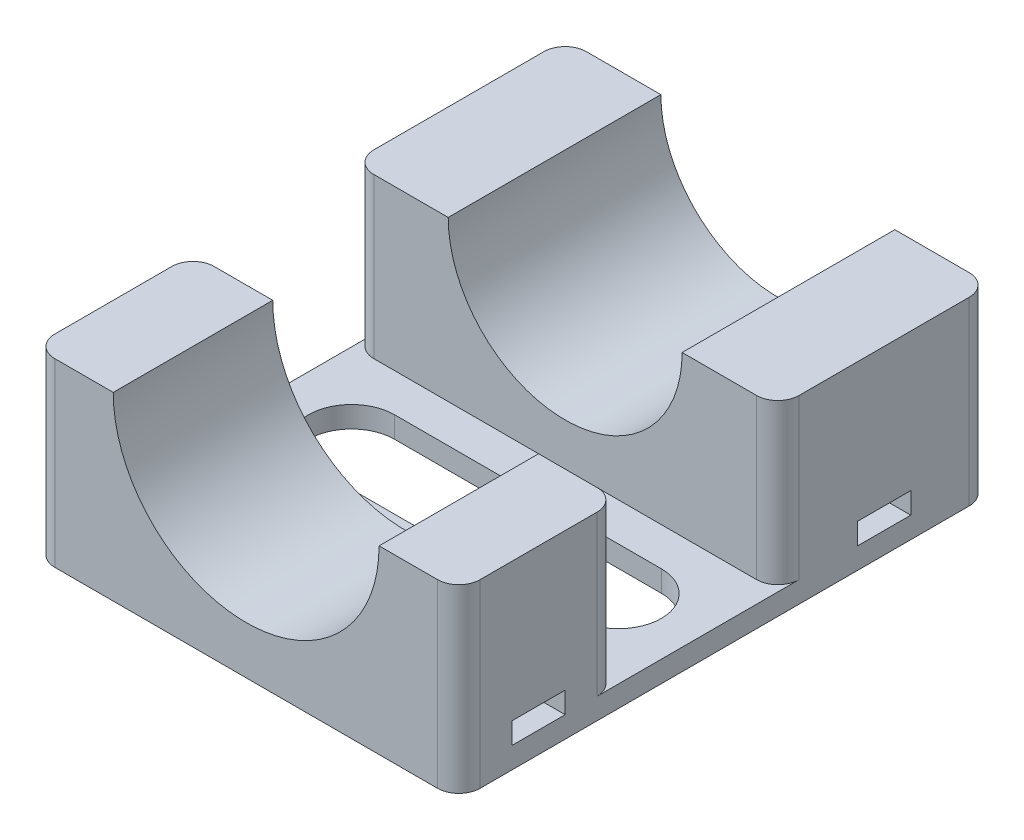
ISO-10303-21;
HEADER;
FILE_DESCRIPTION(('STEP AP214'),'2;1');
FILE_NAME('part.step','',(''),(''),'','','');
FILE_SCHEMA(('AUTOMOTIVE_DESIGN { 1 0 10303 214 1 1 1 1 }'));
ENDSEC;
DATA;
#1=APPLICATION_CONTEXT('core data for automotive mechanical design processes');
#2=APPLICATION_PROTOCOL_DEFINITION('international standard','automotive_design',2000,#1);
#3=PRODUCT_CONTEXT('',#1,'mechanical');
#4=PRODUCT('Part','Part','',(#3));
#5=PRODUCT_RELATED_PRODUCT_CATEGORY('part','',(#4));
#6=PRODUCT_DEFINITION_FORMATION('','',#4);
#7=PRODUCT_DEFINITION_CONTEXT('part definition',#1,'design');
#8=PRODUCT_DEFINITION('design','',#6,#7);
#9=PRODUCT_DEFINITION_SHAPE('','',#8);
#10=(LENGTH_UNIT() NAMED_UNIT(*) SI_UNIT(.MILLI.,.METRE.));
#11=(NAMED_UNIT(*) PLANE_ANGLE_UNIT() SI_UNIT($,.RADIAN.));
#12=(NAMED_UNIT(*) SI_UNIT($,.STERADIAN.) SOLID_ANGLE_UNIT());
#13=UNCERTAINTY_MEASURE_WITH_UNIT(LENGTH_MEASURE(1.E-05),#10,'distance_accuracy_value','');
#14=(GEOMETRIC_REPRESENTATION_CONTEXT(3) GLOBAL_UNCERTAINTY_ASSIGNED_CONTEXT((#13)) GLOBAL_UNIT_ASSIGNED_CONTEXT((#10,
#11,#12)) REPRESENTATION_CONTEXT('',''));
#15=CARTESIAN_POINT('',(0.,0.,0.));
#16=DIRECTION('',(0.,0.,1.));
#17=DIRECTION('',(1.,0.,0.));
#18=AXIS2_PLACEMENT_3D('',#15,#16,#17);
#19=CARTESIAN_POINT('',(18.,2.,23.));
#20=DIRECTION('',(0.,-1.,0.));
#21=DIRECTION('',(0.,0.,-1.));
#22=AXIS2_PLACEMENT_3D('',#19,#20,#21);
#23=CYLINDRICAL_SURFACE('',#22,2.);
#24=DIRECTION('',(0.,-1.,0.));
#25=VECTOR('',#24,1.);
#26=CARTESIAN_POINT('',(20.,2.,23.));
#27=LINE('',#26,#25);
#28=CARTESIAN_POINT('',(20.,17.,23.));
#29=VERTEX_POINT('',#28);
#30=CARTESIAN_POINT('',(20.,0.,23.));
#31=VERTEX_POINT('',#30);
#32=EDGE_CURVE('E479',#29,#31,#27,.T.);
#33=ORIENTED_EDGE('',*,*,#32,.F.);
#34=CARTESIAN_POINT('',(18.,17.,23.));
#35=DIRECTION('',(0.,1.,0.));
#36=DIRECTION('',(0.,0.,1.));
#37=AXIS2_PLACEMENT_3D('',#34,#35,#36);
#38=CIRCLE('',#37,2.);
#39=CARTESIAN_POINT('',(18.,17.,25.));
#40=VERTEX_POINT('',#39);
#41=EDGE_CURVE('E40',#40,#29,#38,.T.);
#42=ORIENTED_EDGE('',*,*,#41,.F.);
#43=DIRECTION('',(0.,-1.,0.));
#44=VECTOR('',#43,1.);
#45=CARTESIAN_POINT('',(18.,2.,25.));
#46=LINE('',#45,#44);
#47=CARTESIAN_POINT('',(18.,0.,25.));
#48=VERTEX_POINT('',#47);
#49=EDGE_CURVE('E482',#48,#40,#46,.F.);
#50=ORIENTED_EDGE('',*,*,#49,.F.);
#51=CARTESIAN_POINT('',(18.,0.,23.));
#52=DIRECTION('',(0.,-1.,0.));
#53=DIRECTION('',(0.,0.,-1.));
#54=AXIS2_PLACEMENT_3D('',#51,#52,#53);
#55=CIRCLE('',#54,2.);
#56=EDGE_CURVE('E11',#31,#48,#55,.T.);
#57=ORIENTED_EDGE('',*,*,#56,.F.);
#58=EDGE_LOOP('',(#33,#42,#50,#57));
#59=FACE_BOUND('',#58,.T.);
#60=ADVANCED_FACE('F33',(#59),#23,.T.);
#61=CARTESIAN_POINT('',(18.,17.,-7.));
#62=DIRECTION('',(0.,1.,0.));
#63=DIRECTION('',(0.,0.,1.));
#64=AXIS2_PLACEMENT_3D('',#61,#62,#63);
#65=CYLINDRICAL_SURFACE('',#64,2.);
#66=DIRECTION('',(0.,1.,0.));
#67=VECTOR('',#66,1.);
#68=CARTESIAN_POINT('',(18.,17.,-5.));
#69=LINE('',#68,#67);
#70=CARTESIAN_POINT('',(18.,2.,-5.));
#71=VERTEX_POINT('',#70);
#72=CARTESIAN_POINT('',(18.,17.,-5.));
#73=VERTEX_POINT('',#72);
#74=EDGE_CURVE('E468',#71,#73,#69,.T.);
#75=ORIENTED_EDGE('',*,*,#74,.F.);
#76=CARTESIAN_POINT('',(18.,2.,-7.));
#77=DIRECTION('',(0.,-1.,0.));
#78=DIRECTION('',(0.,0.,-1.));
#79=AXIS2_PLACEMENT_3D('',#76,#77,#78);
#80=CIRCLE('',#79,2.);
#81=CARTESIAN_POINT('',(20.,2.,-7.));
#82=VERTEX_POINT('',#81);
#83=EDGE_CURVE('E476',#71,#82,#80,.F.);
#84=ORIENTED_EDGE('',*,*,#83,.T.);
#85=DIRECTION('',(0.,1.,0.));
#86=VECTOR('',#85,1.);
#87=CARTESIAN_POINT('',(20.,2.,-7.));
#88=LINE('',#87,#86);
#89=CARTESIAN_POINT('',(20.,17.,-7.));
#90=VERTEX_POINT('',#89);
#91=EDGE_CURVE('E471',#90,#82,#88,.F.);
#92=ORIENTED_EDGE('',*,*,#91,.F.);
#93=CARTESIAN_POINT('',(18.,17.,-7.));
#94=DIRECTION('',(0.,1.,0.));
#95=DIRECTION('',(0.,0.,1.));
#96=AXIS2_PLACEMENT_3D('',#93,#94,#95);
#97=CIRCLE('',#96,2.);
#98=EDGE_CURVE('E474',#73,#90,#97,.T.);
#99=ORIENTED_EDGE('',*,*,#98,.F.);
#100=EDGE_LOOP('',(#75,#84,#92,#99));
#101=FACE_BOUND('',#100,.T.);
#102=ADVANCED_FACE('F547',(#101),#65,.T.);
#103=CARTESIAN_POINT('',(18.,17.,12.));
#104=DIRECTION('',(0.,-1.,0.));
#105=DIRECTION('',(0.,0.,-1.));
#106=AXIS2_PLACEMENT_3D('',#103,#104,#105);
#107=CYLINDRICAL_SURFACE('',#106,2.);
#108=DIRECTION('',(0.,-1.,0.));
#109=VECTOR('',#108,1.);
#110=CARTESIAN_POINT('',(18.,17.,10.));
#111=LINE('',#110,#109);
#112=CARTESIAN_POINT('',(18.,17.,10.));
#113=VERTEX_POINT('',#112);
#114=CARTESIAN_POINT('',(18.,2.,10.));
#115=VERTEX_POINT('',#114);
#116=EDGE_CURVE('E458',#113,#115,#111,.T.);
#117=ORIENTED_EDGE('',*,*,#116,.F.);
#118=CARTESIAN_POINT('',(18.,17.,12.));
#119=DIRECTION('',(0.,1.,0.));
#120=DIRECTION('',(0.,0.,1.));
#121=AXIS2_PLACEMENT_3D('',#118,#119,#120);
#122=CIRCLE('',#121,2.);
#123=CARTESIAN_POINT('',(20.,17.,12.));
#124=VERTEX_POINT('',#123);
#125=EDGE_CURVE('E464',#124,#113,#122,.T.);
#126=ORIENTED_EDGE('',*,*,#125,.F.);
#127=DIRECTION('',(0.,-1.,0.));
#128=VECTOR('',#127,1.);
#129=CARTESIAN_POINT('',(20.,2.,12.));
#130=LINE('',#129,#128);
#131=CARTESIAN_POINT('',(20.,2.,12.));
#132=VERTEX_POINT('',#131);
#133=EDGE_CURVE('E461',#132,#124,#130,.F.);
#134=ORIENTED_EDGE('',*,*,#133,.F.);
#135=CARTESIAN_POINT('',(18.,2.,12.));
#136=DIRECTION('',(0.,-1.,0.));
#137=DIRECTION('',(0.,0.,-1.));
#138=AXIS2_PLACEMENT_3D('',#135,#136,#137);
#139=CIRCLE('',#138,2.);
#140=EDGE_CURVE('E466',#132,#115,#139,.F.);
#141=ORIENTED_EDGE('',*,*,#140,.T.);
#142=EDGE_LOOP('',(#117,#126,#134,#141));
#143=FACE_BOUND('',#142,.T.);
#144=ADVANCED_FACE('F495',(#143),#107,.T.);
#145=CARTESIAN_POINT('',(18.,2.,-23.));
#146=DIRECTION('',(0.,1.,0.));
#147=DIRECTION('',(0.,0.,1.));
#148=AXIS2_PLACEMENT_3D('',#145,#146,#147);
#149=CYLINDRICAL_SURFACE('',#148,2.);
#150=DIRECTION('',(0.,-1.,0.));
#151=VECTOR('',#150,1.);
#152=CARTESIAN_POINT('',(18.,2.,-25.));
#153=LINE('',#152,#151);
#154=CARTESIAN_POINT('',(18.,17.,-25.));
#155=VERTEX_POINT('',#154);
#156=CARTESIAN_POINT('',(18.,0.,-25.));
#157=VERTEX_POINT('',#156);
#158=EDGE_CURVE('E447',#155,#157,#153,.T.);
#159=ORIENTED_EDGE('',*,*,#158,.F.);
#160=CARTESIAN_POINT('',(18.,17.,-23.));
#161=DIRECTION('',(0.,1.,0.));
#162=DIRECTION('',(0.,0.,1.));
#163=AXIS2_PLACEMENT_3D('',#160,#161,#162);
#164=CIRCLE('',#163,2.);
#165=CARTESIAN_POINT('',(20.,17.,-23.));
#166=VERTEX_POINT('',#165);
#167=EDGE_CURVE('E453',#166,#155,#164,.T.);
#168=ORIENTED_EDGE('',*,*,#167,.F.);
#169=DIRECTION('',(0.,-1.,0.));
#170=VECTOR('',#169,1.);
#171=CARTESIAN_POINT('',(20.,2.,-23.));
#172=LINE('',#171,#170);
#173=CARTESIAN_POINT('',(20.,0.,-23.));
#174=VERTEX_POINT('',#173);
#175=EDGE_CURVE('E450',#174,#166,#172,.F.);
#176=ORIENTED_EDGE('',*,*,#175,.F.);
#177=CARTESIAN_POINT('',(18.,0.,-23.));
#178=DIRECTION('',(0.,-1.,0.));
#179=DIRECTION('',(0.,0.,-1.));
#180=AXIS2_PLACEMENT_3D('',#177,#178,#179);
#181=CIRCLE('',#180,2.);
#182=EDGE_CURVE('E455',#157,#174,#181,.T.);
#183=ORIENTED_EDGE('',*,*,#182,.F.);
#184=EDGE_LOOP('',(#159,#168,#176,#183));
#185=FACE_BOUND('',#184,.T.);
#186=ADVANCED_FACE('F537',(#185),#149,.T.);
#187=CARTESIAN_POINT('',(-18.,2.,-23.));
#188=DIRECTION('',(0.,-1.,0.));
#189=DIRECTION('',(0.,0.,-1.));
#190=AXIS2_PLACEMENT_3D('',#187,#188,#189);
#191=CYLINDRICAL_SURFACE('',#190,2.);
#192=DIRECTION('',(0.,-1.,0.));
#193=VECTOR('',#192,1.);
#194=CARTESIAN_POINT('',(-20.,2.,-23.));
#195=LINE('',#194,#193);
#196=CARTESIAN_POINT('',(-20.,17.,-23.));
#197=VERTEX_POINT('',#196);
#198=CARTESIAN_POINT('',(-20.,0.,-23.));
#199=VERTEX_POINT('',#198);
#200=EDGE_CURVE('E437',#197,#199,#195,.T.);
#201=ORIENTED_EDGE('',*,*,#200,.F.);
#202=CARTESIAN_POINT('',(-18.,17.,-23.));
#203=DIRECTION('',(0.,1.,0.));
#204=DIRECTION('',(0.,0.,1.));
#205=AXIS2_PLACEMENT_3D('',#202,#203,#204);
#206=CIRCLE('',#205,2.);
#207=CARTESIAN_POINT('',(-18.,17.,-25.));
#208=VERTEX_POINT('',#207);
#209=EDGE_CURVE('E443',#208,#197,#206,.T.);
#210=ORIENTED_EDGE('',*,*,#209,.F.);
#211=DIRECTION('',(0.,-1.,0.));
#212=VECTOR('',#211,1.);
#213=CARTESIAN_POINT('',(-18.,2.,-25.));
#214=LINE('',#213,#212);
#215=CARTESIAN_POINT('',(-18.,0.,-25.));
#216=VERTEX_POINT('',#215);
#217=EDGE_CURVE('E440',#216,#208,#214,.F.);
#218=ORIENTED_EDGE('',*,*,#217,.F.);
#219=CARTESIAN_POINT('',(-18.,0.,-23.));
#220=DIRECTION('',(0.,-1.,0.));
#221=DIRECTION('',(0.,0.,-1.));
#222=AXIS2_PLACEMENT_3D('',#219,#220,#221);
#223=CIRCLE('',#222,2.);
#224=EDGE_CURVE('E445',#199,#216,#223,.T.);
#225=ORIENTED_EDGE('',*,*,#224,.F.);
#226=EDGE_LOOP('',(#201,#210,#218,#225));
#227=FACE_BOUND('',#226,.T.);
#228=ADVANCED_FACE('F524',(#227),#191,.T.);
#229=CARTESIAN_POINT('',(-18.,2.,23.));
#230=DIRECTION('',(0.,1.,0.));
#231=DIRECTION('',(0.,0.,1.));
#232=AXIS2_PLACEMENT_3D('',#229,#230,#231);
#233=CYLINDRICAL_SURFACE('',#232,2.);
#234=DIRECTION('',(0.,-1.,0.));
#235=VECTOR('',#234,1.);
#236=CARTESIAN_POINT('',(-18.,2.,25.));
#237=LINE('',#236,#235);
#238=CARTESIAN_POINT('',(-18.,17.,25.));
#239=VERTEX_POINT('',#238);
#240=CARTESIAN_POINT('',(-18.,0.,25.));
#241=VERTEX_POINT('',#240);
#242=EDGE_CURVE('E427',#239,#241,#237,.T.);
#243=ORIENTED_EDGE('',*,*,#242,.F.);
#244=CARTESIAN_POINT('',(-18.,17.,23.));
#245=DIRECTION('',(0.,1.,0.));
#246=DIRECTION('',(0.,0.,1.));
#247=AXIS2_PLACEMENT_3D('',#244,#245,#246);
#248=CIRCLE('',#247,2.);
#249=CARTESIAN_POINT('',(-20.,17.,23.));
#250=VERTEX_POINT('',#249);
#251=EDGE_CURVE('E433',#250,#239,#248,.T.);
#252=ORIENTED_EDGE('',*,*,#251,.F.);
#253=DIRECTION('',(0.,-1.,0.));
#254=VECTOR('',#253,1.);
#255=CARTESIAN_POINT('',(-20.,2.,23.));
#256=LINE('',#255,#254);
#257=CARTESIAN_POINT('',(-20.,0.,23.));
#258=VERTEX_POINT('',#257);
#259=EDGE_CURVE('E430',#258,#250,#256,.F.);
#260=ORIENTED_EDGE('',*,*,#259,.F.);
#261=CARTESIAN_POINT('',(-18.,0.,23.));
#262=DIRECTION('',(0.,-1.,0.));
#263=DIRECTION('',(0.,0.,-1.));
#264=AXIS2_PLACEMENT_3D('',#261,#262,#263);
#265=CIRCLE('',#264,2.);
#266=EDGE_CURVE('E435',#241,#258,#265,.T.);
#267=ORIENTED_EDGE('',*,*,#266,.F.);
#268=EDGE_LOOP('',(#243,#252,#260,#267));
#269=FACE_BOUND('',#268,.T.);
#270=ADVANCED_FACE('F517',(#269),#233,.T.);
#271=CARTESIAN_POINT('',(-18.,17.,-7.));
#272=DIRECTION('',(0.,1.,0.));
#273=DIRECTION('',(0.,0.,1.));
#274=AXIS2_PLACEMENT_3D('',#271,#272,#273);
#275=CYLINDRICAL_SURFACE('',#274,2.);
#276=DIRECTION('',(0.,-1.,0.));
#277=VECTOR('',#276,1.);
#278=CARTESIAN_POINT('',(-18.,17.,-5.));
#279=LINE('',#278,#277);
#280=CARTESIAN_POINT('',(-18.,17.,-5.));
#281=VERTEX_POINT('',#280);
#282=CARTESIAN_POINT('',(-18.,2.,-5.));
#283=VERTEX_POINT('',#282);
#284=EDGE_CURVE('E417',#281,#283,#279,.T.);
#285=ORIENTED_EDGE('',*,*,#284,.F.);
#286=CARTESIAN_POINT('',(-18.,17.,-7.));
#287=DIRECTION('',(0.,1.,0.));
#288=DIRECTION('',(0.,0.,1.));
#289=AXIS2_PLACEMENT_3D('',#286,#287,#288);
#290=CIRCLE('',#289,2.);
#291=CARTESIAN_POINT('',(-20.,17.,-7.));
#292=VERTEX_POINT('',#291);
#293=EDGE_CURVE('E423',#292,#281,#290,.T.);
#294=ORIENTED_EDGE('',*,*,#293,.F.);
#295=DIRECTION('',(0.,-1.,0.));
#296=VECTOR('',#295,1.);
#297=CARTESIAN_POINT('',(-20.,17.,-7.));
#298=LINE('',#297,#296);
#299=CARTESIAN_POINT('',(-20.,2.,-7.));
#300=VERTEX_POINT('',#299);
#301=EDGE_CURVE('E420',#300,#292,#298,.F.);
#302=ORIENTED_EDGE('',*,*,#301,.F.);
#303=CARTESIAN_POINT('',(-18.,2.,-7.));
#304=DIRECTION('',(0.,-1.,0.));
#305=DIRECTION('',(0.,0.,-1.));
#306=AXIS2_PLACEMENT_3D('',#303,#304,#305);
#307=CIRCLE('',#306,2.);
#308=EDGE_CURVE('E425',#300,#283,#307,.F.);
#309=ORIENTED_EDGE('',*,*,#308,.T.);
#310=EDGE_LOOP('',(#285,#294,#302,#309));
#311=FACE_BOUND('',#310,.T.);
#312=ADVANCED_FACE('F560',(#311),#275,.T.);
#313=CARTESIAN_POINT('',(-18.,17.,12.));
#314=DIRECTION('',(0.,-1.,0.));
#315=DIRECTION('',(0.,0.,-1.));
#316=AXIS2_PLACEMENT_3D('',#313,#314,#315);
#317=CYLINDRICAL_SURFACE('',#316,2.);
#318=DIRECTION('',(0.,1.,0.));
#319=VECTOR('',#318,1.);
#320=CARTESIAN_POINT('',(-18.,17.,10.));
#321=LINE('',#320,#319);
#322=CARTESIAN_POINT('',(-18.,2.,10.));
#323=VERTEX_POINT('',#322);
#324=CARTESIAN_POINT('',(-18.,17.,10.));
#325=VERTEX_POINT('',#324);
#326=EDGE_CURVE('E406',#323,#325,#321,.T.);
#327=ORIENTED_EDGE('',*,*,#326,.F.);
#328=CARTESIAN_POINT('',(-18.,2.,12.));
#329=DIRECTION('',(0.,-1.,0.));
#330=DIRECTION('',(0.,0.,-1.));
#331=AXIS2_PLACEMENT_3D('',#328,#329,#330);
#332=CIRCLE('',#331,2.);
#333=CARTESIAN_POINT('',(-20.,2.,12.));
#334=VERTEX_POINT('',#333);
#335=EDGE_CURVE('E414',#323,#334,#332,.F.);
#336=ORIENTED_EDGE('',*,*,#335,.T.);
#337=DIRECTION('',(0.,1.,0.));
#338=VECTOR('',#337,1.);
#339=CARTESIAN_POINT('',(-20.,17.,12.));
#340=LINE('',#339,#338);
#341=CARTESIAN_POINT('',(-20.,17.,12.));
#342=VERTEX_POINT('',#341);
#343=EDGE_CURVE('E409',#342,#334,#340,.F.);
#344=ORIENTED_EDGE('',*,*,#343,.F.);
#345=CARTESIAN_POINT('',(-18.,17.,12.));
#346=DIRECTION('',(0.,1.,0.));
#347=DIRECTION('',(0.,0.,1.));
#348=AXIS2_PLACEMENT_3D('',#345,#346,#347);
#349=CIRCLE('',#348,2.);
#350=EDGE_CURVE('E412',#325,#342,#349,.T.);
#351=ORIENTED_EDGE('',*,*,#350,.F.);
#352=EDGE_LOOP('',(#327,#336,#344,#351));
#353=FACE_BOUND('',#352,.T.);
#354=ADVANCED_FACE('F555',(#353),#317,.T.);
#355=CARTESIAN_POINT('',(0.,17.,0.));
#356=DIRECTION('',(0.,1.,0.));
#357=DIRECTION('',(0.,0.,1.));
#358=AXIS2_PLACEMENT_3D('',#355,#356,#357);
#359=PLANE('',#358);
#360=DIRECTION('',(1.,0.,0.));
#361=VECTOR('',#360,1.);
#362=CARTESIAN_POINT('',(-20.,17.,-5.));
#363=LINE('',#362,#361);
#364=CARTESIAN_POINT('',(11.,17.,-5.));
#365=VERTEX_POINT('',#364);
#366=EDGE_CURVE('E365',#365,#73,#363,.T.);
#367=ORIENTED_EDGE('',*,*,#366,.T.);
#368=ORIENTED_EDGE('',*,*,#98,.T.);
#369=DIRECTION('',(0.,0.,-1.));
#370=VECTOR('',#369,1.);
#371=CARTESIAN_POINT('',(20.,17.,-25.));
#372=LINE('',#371,#370);
#373=EDGE_CURVE('E358',#90,#166,#372,.T.);
#374=ORIENTED_EDGE('',*,*,#373,.T.);
#375=ORIENTED_EDGE('',*,*,#167,.T.);
#376=DIRECTION('',(-1.,0.,0.));
#377=VECTOR('',#376,1.);
#378=CARTESIAN_POINT('',(-20.,17.,-25.));
#379=LINE('',#378,#377);
#380=CARTESIAN_POINT('',(11.,17.,-25.));
#381=VERTEX_POINT('',#380);
#382=EDGE_CURVE('E361',#155,#381,#379,.T.);
#383=ORIENTED_EDGE('',*,*,#382,.T.);
#384=DIRECTION('',(0.,0.,-1.));
#385=VECTOR('',#384,1.);
#386=CARTESIAN_POINT('',(11.,17.,-3.00000000000001));
#387=LINE('',#386,#385);
#388=EDGE_CURVE('E394',#365,#381,#387,.T.);
#389=ORIENTED_EDGE('',*,*,#388,.F.);
#390=EDGE_LOOP('',(#367,#368,#374,#375,#383,#389));
#391=FACE_BOUND('',#390,.T.);
#392=ADVANCED_FACE('F542',(#391),#359,.T.);
#393=CARTESIAN_POINT('',(0.,17.,0.));
#394=DIRECTION('',(0.,1.,0.));
#395=DIRECTION('',(0.,0.,1.));
#396=AXIS2_PLACEMENT_3D('',#393,#394,#395);
#397=PLANE('',#396);
#398=DIRECTION('',(0.,0.,1.));
#399=VECTOR('',#398,1.);
#400=CARTESIAN_POINT('',(-20.,17.,10.));
#401=LINE('',#400,#399);
#402=EDGE_CURVE('E350',#342,#250,#401,.T.);
#403=ORIENTED_EDGE('',*,*,#402,.T.);
#404=ORIENTED_EDGE('',*,*,#251,.T.);
#405=DIRECTION('',(1.,0.,0.));
#406=VECTOR('',#405,1.);
#407=CARTESIAN_POINT('',(-20.,17.,25.));
#408=LINE('',#407,#406);
#409=CARTESIAN_POINT('',(-12.5,17.,25.));
#410=VERTEX_POINT('',#409);
#411=EDGE_CURVE('E354',#239,#410,#408,.T.);
#412=ORIENTED_EDGE('',*,*,#411,.T.);
#413=DIRECTION('',(0.,0.,1.));
#414=VECTOR('',#413,1.);
#415=CARTESIAN_POINT('',(-12.5,17.,3.00000000000001));
#416=LINE('',#415,#414);
#417=CARTESIAN_POINT('',(-12.5,17.,10.));
#418=VERTEX_POINT('',#417);
#419=EDGE_CURVE('E388',#418,#410,#416,.T.);
#420=ORIENTED_EDGE('',*,*,#419,.F.);
#421=DIRECTION('',(-1.,0.,0.));
#422=VECTOR('',#421,1.);
#423=CARTESIAN_POINT('',(-20.,17.,10.));
#424=LINE('',#423,#422);
#425=EDGE_CURVE('E347',#418,#325,#424,.T.);
#426=ORIENTED_EDGE('',*,*,#425,.T.);
#427=ORIENTED_EDGE('',*,*,#350,.T.);
#428=EDGE_LOOP('',(#403,#404,#412,#420,#426,#427));
#429=FACE_BOUND('',#428,.T.);
#430=ADVANCED_FACE('F507',(#429),#397,.T.);
#431=CARTESIAN_POINT('',(0.,2.,0.));
#432=DIRECTION('',(0.,-1.,0.));
#433=DIRECTION('',(0.,0.,-1.));
#434=AXIS2_PLACEMENT_3D('',#431,#432,#433);
#435=PLANE('',#434);
#436=DIRECTION('',(1.,0.,0.));
#437=VECTOR('',#436,1.);
#438=CARTESIAN_POINT('',(-12.4491667553599,2.,6.69120143499498));
#439=LINE('',#438,#437);
#440=CARTESIAN_POINT('',(-12.4491667553599,2.,6.69120143499498));
#441=VERTEX_POINT('',#440);
#442=CARTESIAN_POINT('',(12.6330979577881,2.,6.69120143499498));
#443=VERTEX_POINT('',#442);
#444=EDGE_CURVE('E316',#441,#443,#439,.T.);
#445=ORIENTED_EDGE('',*,*,#444,.F.);
#446=CARTESIAN_POINT('',(-12.4491667553599,2.,2.64174453734932));
#447=DIRECTION('',(0.,1.,0.));
#448=DIRECTION('',(0.,0.,1.));
#449=AXIS2_PLACEMENT_3D('',#446,#447,#448);
#450=CIRCLE('',#449,4.04945689764566);
#451=CARTESIAN_POINT('',(-12.4491667553599,2.,-1.40771236029634));
#452=VERTEX_POINT('',#451);
#453=EDGE_CURVE('E308',#452,#441,#450,.T.);
#454=ORIENTED_EDGE('',*,*,#453,.F.);
#455=DIRECTION('',(-1.,0.,0.));
#456=VECTOR('',#455,1.);
#457=CARTESIAN_POINT('',(-12.4491667553599,2.,-1.40771236029634));
#458=LINE('',#457,#456);
#459=CARTESIAN_POINT('',(12.6330979577881,2.,-1.40771236029634));
#460=VERTEX_POINT('',#459);
#461=EDGE_CURVE('E322',#460,#452,#458,.T.);
#462=ORIENTED_EDGE('',*,*,#461,.F.);
#463=CARTESIAN_POINT('',(12.6330979577881,2.,2.64174453734932));
#464=DIRECTION('',(0.,1.,0.));
#465=DIRECTION('',(0.,0.,1.));
#466=AXIS2_PLACEMENT_3D('',#463,#464,#465);
#467=CIRCLE('',#466,4.04945689764566);
#468=EDGE_CURVE('E319',#443,#460,#467,.T.);
#469=ORIENTED_EDGE('',*,*,#468,.F.);
#470=EDGE_LOOP('',(#445,#454,#462,#469));
#471=FACE_BOUND('',#470,.T.);
#472=DIRECTION('',(-1.,0.,0.));
#473=VECTOR('',#472,1.);
#474=CARTESIAN_POINT('',(-20.,2.,10.));
#475=LINE('',#474,#473);
#476=EDGE_CURVE('E344',#115,#323,#475,.T.);
#477=ORIENTED_EDGE('',*,*,#476,.F.);
#478=ORIENTED_EDGE('',*,*,#140,.F.);
#479=DIRECTION('',(0.,0.,-1.));
#480=VECTOR('',#479,1.);
#481=CARTESIAN_POINT('',(20.,2.,25.));
#482=LINE('',#481,#480);
#483=EDGE_CURVE('E373',#132,#82,#482,.T.);
#484=ORIENTED_EDGE('',*,*,#483,.T.);
#485=ORIENTED_EDGE('',*,*,#83,.F.);
#486=DIRECTION('',(1.,0.,0.));
#487=VECTOR('',#486,1.);
#488=CARTESIAN_POINT('',(-20.,2.,-5.));
#489=LINE('',#488,#487);
#490=EDGE_CURVE('E356',#283,#71,#489,.T.);
#491=ORIENTED_EDGE('',*,*,#490,.F.);
#492=ORIENTED_EDGE('',*,*,#308,.F.);
#493=DIRECTION('',(0.,0.,-1.));
#494=VECTOR('',#493,1.);
#495=CARTESIAN_POINT('',(-20.,2.,25.));
#496=LINE('',#495,#494);
#497=EDGE_CURVE('E371',#334,#300,#496,.T.);
#498=ORIENTED_EDGE('',*,*,#497,.F.);
#499=ORIENTED_EDGE('',*,*,#335,.F.);
#500=EDGE_LOOP('',(#477,#478,#484,#485,#491,#492,#498,#499));
#501=FACE_BOUND('',#500,.T.);
#502=ADVANCED_FACE('F551',(#471,#501),#435,.F.);
#503=CARTESIAN_POINT('',(-20.,2.,25.));
#504=DIRECTION('',(-1.,0.,0.));
#505=DIRECTION('',(0.,0.,1.));
#506=AXIS2_PLACEMENT_3D('',#503,#504,#505);
#507=PLANE('',#506);
#508=DIRECTION('',(0.,1.,0.));
#509=VECTOR('',#508,1.);
#510=CARTESIAN_POINT('',(-20.,2.,20.));
#511=LINE('',#510,#509);
#512=CARTESIAN_POINT('',(-20.,2.,20.));
#513=VERTEX_POINT('',#512);
#514=CARTESIAN_POINT('',(-20.,4.,20.));
#515=VERTEX_POINT('',#514);
#516=EDGE_CURVE('E246',#513,#515,#511,.T.);
#517=ORIENTED_EDGE('',*,*,#516,.F.);
#518=DIRECTION('',(0.,0.,1.));
#519=VECTOR('',#518,1.);
#520=CARTESIAN_POINT('',(-20.,2.,15.));
#521=LINE('',#520,#519);
#522=CARTESIAN_POINT('',(-20.,2.,15.));
#523=VERTEX_POINT('',#522);
#524=EDGE_CURVE('E264',#523,#513,#521,.T.);
#525=ORIENTED_EDGE('',*,*,#524,.F.);
#526=DIRECTION('',(0.,-1.,0.));
#527=VECTOR('',#526,1.);
#528=CARTESIAN_POINT('',(-20.,2.,15.));
#529=LINE('',#528,#527);
#530=CARTESIAN_POINT('',(-20.,4.,15.));
#531=VERTEX_POINT('',#530);
#532=EDGE_CURVE('E267',#531,#523,#529,.T.);
#533=ORIENTED_EDGE('',*,*,#532,.F.);
#534=DIRECTION('',(0.,0.,-1.));
#535=VECTOR('',#534,1.);
#536=CARTESIAN_POINT('',(-20.,4.,15.));
#537=LINE('',#536,#535);
#538=EDGE_CURVE('E273',#515,#531,#537,.T.);
#539=ORIENTED_EDGE('',*,*,#538,.F.);
#540=EDGE_LOOP('',(#517,#525,#533,#539));
#541=FACE_BOUND('',#540,.T.);
#542=DIRECTION('',(0.,1.,0.));
#543=VECTOR('',#542,1.);
#544=CARTESIAN_POINT('',(-20.,2.,-12.5));
#545=LINE('',#544,#543);
#546=CARTESIAN_POINT('',(-20.,2.,-12.5));
#547=VERTEX_POINT('',#546);
#548=CARTESIAN_POINT('',(-20.,4.,-12.5));
#549=VERTEX_POINT('',#548);
#550=EDGE_CURVE('E279',#547,#549,#545,.T.);
#551=ORIENTED_EDGE('',*,*,#550,.F.);
#552=DIRECTION('',(0.,0.,1.));
#553=VECTOR('',#552,1.);
#554=CARTESIAN_POINT('',(-20.,2.,-17.5));
#555=LINE('',#554,#553);
#556=CARTESIAN_POINT('',(-20.,2.,-17.5));
#557=VERTEX_POINT('',#556);
#558=EDGE_CURVE('E287',#557,#547,#555,.T.);
#559=ORIENTED_EDGE('',*,*,#558,.F.);
#560=DIRECTION('',(0.,-1.,0.));
#561=VECTOR('',#560,1.);
#562=CARTESIAN_POINT('',(-20.,2.,-17.5));
#563=LINE('',#562,#561);
#564=CARTESIAN_POINT('',(-20.,4.,-17.5));
#565=VERTEX_POINT('',#564);
#566=EDGE_CURVE('E301',#565,#557,#563,.T.);
#567=ORIENTED_EDGE('',*,*,#566,.F.);
#568=DIRECTION('',(0.,0.,-1.));
#569=VECTOR('',#568,1.);
#570=CARTESIAN_POINT('',(-20.,4.,-17.5));
#571=LINE('',#570,#569);
#572=EDGE_CURVE('E298',#549,#565,#571,.T.);
#573=ORIENTED_EDGE('',*,*,#572,.F.);
#574=EDGE_LOOP('',(#551,#559,#567,#573));
#575=FACE_BOUND('',#574,.T.);
#576=DIRECTION('',(0.,0.,1.));
#577=VECTOR('',#576,1.);
#578=CARTESIAN_POINT('',(-20.,17.,-25.));
#579=LINE('',#578,#577);
#580=EDGE_CURVE('E363',#197,#292,#579,.T.);
#581=ORIENTED_EDGE('',*,*,#580,.F.);
#582=ORIENTED_EDGE('',*,*,#200,.T.);
#583=DIRECTION('',(0.,0.,-1.));
#584=VECTOR('',#583,1.);
#585=CARTESIAN_POINT('',(-20.,0.,25.));
#586=LINE('',#585,#584);
#587=EDGE_CURVE('E368',#258,#199,#586,.T.);
#588=ORIENTED_EDGE('',*,*,#587,.F.);
#589=ORIENTED_EDGE('',*,*,#259,.T.);
#590=ORIENTED_EDGE('',*,*,#402,.F.);
#591=ORIENTED_EDGE('',*,*,#343,.T.);
#592=ORIENTED_EDGE('',*,*,#497,.T.);
#593=ORIENTED_EDGE('',*,*,#301,.T.);
#594=EDGE_LOOP('',(#581,#582,#588,#589,#590,#591,#592,#593));
#595=FACE_BOUND('',#594,.T.);
#596=ADVANCED_FACE('F521',(#541,#575,#595),#507,.T.);
#597=CARTESIAN_POINT('',(-20.,2.,25.));
#598=DIRECTION('',(0.,0.,-1.));
#599=DIRECTION('',(-1.,0.,0.));
#600=AXIS2_PLACEMENT_3D('',#597,#598,#599);
#601=PLANE('',#600);
#602=DIRECTION('',(1.,0.,0.));
#603=VECTOR('',#602,1.);
#604=CARTESIAN_POINT('',(-20.,0.,25.));
#605=LINE('',#604,#603);
#606=EDGE_CURVE('E374',#241,#48,#605,.T.);
#607=ORIENTED_EDGE('',*,*,#606,.T.);
#608=ORIENTED_EDGE('',*,*,#49,.T.);
#609=CARTESIAN_POINT('',(12.5,17.,25.));
#610=VERTEX_POINT('',#609);
#611=EDGE_CURVE('E353',#610,#40,#408,.T.);
#612=ORIENTED_EDGE('',*,*,#611,.F.);
#613=CARTESIAN_POINT('',(0.,17.,25.));
#614=DIRECTION('',(0.,0.,1.));
#615=DIRECTION('',(1.,0.,0.));
#616=AXIS2_PLACEMENT_3D('',#613,#614,#615);
#617=CIRCLE('',#616,12.5);
#618=EDGE_CURVE('E339',#410,#610,#617,.T.);
#619=ORIENTED_EDGE('',*,*,#618,.F.);
#620=ORIENTED_EDGE('',*,*,#411,.F.);
#621=ORIENTED_EDGE('',*,*,#242,.T.);
#622=EDGE_LOOP('',(#607,#608,#612,#619,#620,#621));
#623=FACE_BOUND('',#622,.T.);
#624=ADVANCED_FACE('F511',(#623),#601,.F.);
#625=CARTESIAN_POINT('',(20.,2.,25.));
#626=DIRECTION('',(-1.,0.,0.));
#627=DIRECTION('',(0.,0.,1.));
#628=AXIS2_PLACEMENT_3D('',#625,#626,#627);
#629=PLANE('',#628);
#630=DIRECTION('',(0.,0.,1.));
#631=VECTOR('',#630,1.);
#632=CARTESIAN_POINT('',(20.,2.,15.));
#633=LINE('',#632,#631);
#634=CARTESIAN_POINT('',(20.,2.,15.));
#635=VERTEX_POINT('',#634);
#636=CARTESIAN_POINT('',(20.,2.,20.));
#637=VERTEX_POINT('',#636);
#638=EDGE_CURVE('E251',#635,#637,#633,.T.);
#639=ORIENTED_EDGE('',*,*,#638,.T.);
#640=DIRECTION('',(0.,1.,0.));
#641=VECTOR('',#640,1.);
#642=CARTESIAN_POINT('',(20.,2.,20.));
#643=LINE('',#642,#641);
#644=CARTESIAN_POINT('',(20.,4.,20.));
#645=VERTEX_POINT('',#644);
#646=EDGE_CURVE('E243',#637,#645,#643,.T.);
#647=ORIENTED_EDGE('',*,*,#646,.T.);
#648=DIRECTION('',(0.,0.,-1.));
#649=VECTOR('',#648,1.);
#650=CARTESIAN_POINT('',(20.,4.,15.));
#651=LINE('',#650,#649);
#652=CARTESIAN_POINT('',(20.,4.,15.));
#653=VERTEX_POINT('',#652);
#654=EDGE_CURVE('E255',#645,#653,#651,.T.);
#655=ORIENTED_EDGE('',*,*,#654,.T.);
#656=DIRECTION('',(0.,-1.,0.));
#657=VECTOR('',#656,1.);
#658=CARTESIAN_POINT('',(20.,2.,15.));
#659=LINE('',#658,#657);
#660=EDGE_CURVE('E259',#653,#635,#659,.T.);
#661=ORIENTED_EDGE('',*,*,#660,.T.);
#662=EDGE_LOOP('',(#639,#647,#655,#661));
#663=FACE_BOUND('',#662,.T.);
#664=DIRECTION('',(0.,0.,1.));
#665=VECTOR('',#664,1.);
#666=CARTESIAN_POINT('',(20.,2.,-17.5));
#667=LINE('',#666,#665);
#668=CARTESIAN_POINT('',(20.,2.,-17.5));
#669=VERTEX_POINT('',#668);
#670=CARTESIAN_POINT('',(20.,2.,-12.5));
#671=VERTEX_POINT('',#670);
#672=EDGE_CURVE('E293',#669,#671,#667,.T.);
#673=ORIENTED_EDGE('',*,*,#672,.T.);
#674=DIRECTION('',(0.,1.,0.));
#675=VECTOR('',#674,1.);
#676=CARTESIAN_POINT('',(20.,2.,-12.5));
#677=LINE('',#676,#675);
#678=CARTESIAN_POINT('',(20.,4.,-12.5));
#679=VERTEX_POINT('',#678);
#680=EDGE_CURVE('E283',#671,#679,#677,.T.);
#681=ORIENTED_EDGE('',*,*,#680,.T.);
#682=DIRECTION('',(0.,0.,-1.));
#683=VECTOR('',#682,1.);
#684=CARTESIAN_POINT('',(20.,4.,-17.5));
#685=LINE('',#684,#683);
#686=CARTESIAN_POINT('',(20.,4.,-17.5));
#687=VERTEX_POINT('',#686);
#688=EDGE_CURVE('E286',#679,#687,#685,.T.);
#689=ORIENTED_EDGE('',*,*,#688,.T.);
#690=DIRECTION('',(0.,-1.,0.));
#691=VECTOR('',#690,1.);
#692=CARTESIAN_POINT('',(20.,2.,-17.5));
#693=LINE('',#692,#691);
#694=EDGE_CURVE('E290',#687,#669,#693,.T.);
#695=ORIENTED_EDGE('',*,*,#694,.T.);
#696=EDGE_LOOP('',(#673,#681,#689,#695));
#697=FACE_BOUND('',#696,.T.);
#698=DIRECTION('',(0.,0.,-1.));
#699=VECTOR('',#698,1.);
#700=CARTESIAN_POINT('',(20.,17.,10.));
#701=LINE('',#700,#699);
#702=EDGE_CURVE('E345',#29,#124,#701,.T.);
#703=ORIENTED_EDGE('',*,*,#702,.F.);
#704=ORIENTED_EDGE('',*,*,#32,.T.);
#705=DIRECTION('',(0.,0.,-1.));
#706=VECTOR('',#705,1.);
#707=CARTESIAN_POINT('',(20.,0.,25.));
#708=LINE('',#707,#706);
#709=EDGE_CURVE('E382',#31,#174,#708,.T.);
#710=ORIENTED_EDGE('',*,*,#709,.T.);
#711=ORIENTED_EDGE('',*,*,#175,.T.);
#712=ORIENTED_EDGE('',*,*,#373,.F.);
#713=ORIENTED_EDGE('',*,*,#91,.T.);
#714=ORIENTED_EDGE('',*,*,#483,.F.);
#715=ORIENTED_EDGE('',*,*,#133,.T.);
#716=EDGE_LOOP('',(#703,#704,#710,#711,#712,#713,#714,#715));
#717=FACE_BOUND('',#716,.T.);
#718=ADVANCED_FACE('F261',(#663,#697,#717),#629,.F.);
#719=CARTESIAN_POINT('',(-20.,2.,-25.));
#720=DIRECTION('',(0.,0.,-1.));
#721=DIRECTION('',(-1.,0.,0.));
#722=AXIS2_PLACEMENT_3D('',#719,#720,#721);
#723=PLANE('',#722);
#724=ORIENTED_EDGE('',*,*,#382,.F.);
#725=ORIENTED_EDGE('',*,*,#158,.T.);
#726=DIRECTION('',(1.,0.,0.));
#727=VECTOR('',#726,1.);
#728=CARTESIAN_POINT('',(-20.,0.,-25.));
#729=LINE('',#728,#727);
#730=EDGE_CURVE('E379',#216,#157,#729,.T.);
#731=ORIENTED_EDGE('',*,*,#730,.F.);
#732=ORIENTED_EDGE('',*,*,#217,.T.);
#733=CARTESIAN_POINT('',(-11.,17.,-25.));
#734=VERTEX_POINT('',#733);
#735=EDGE_CURVE('E360',#734,#208,#379,.T.);
#736=ORIENTED_EDGE('',*,*,#735,.F.);
#737=CARTESIAN_POINT('',(0.,17.,-25.));
#738=DIRECTION('',(0.,0.,-1.));
#739=DIRECTION('',(-1.,0.,0.));
#740=AXIS2_PLACEMENT_3D('',#737,#738,#739);
#741=CIRCLE('',#740,11.);
#742=EDGE_CURVE('E328',#381,#734,#741,.T.);
#743=ORIENTED_EDGE('',*,*,#742,.F.);
#744=EDGE_LOOP('',(#724,#725,#731,#732,#736,#743));
#745=FACE_BOUND('',#744,.T.);
#746=ADVANCED_FACE('F530',(#745),#723,.T.);
#747=CARTESIAN_POINT('',(0.,0.,0.));
#748=DIRECTION('',(0.,-1.,0.));
#749=DIRECTION('',(0.,0.,-1.));
#750=AXIS2_PLACEMENT_3D('',#747,#748,#749);
#751=PLANE('',#750);
#752=CARTESIAN_POINT('',(-12.4491667553599,0.,2.64174453734932));
#753=DIRECTION('',(0.,-1.,0.));
#754=DIRECTION('',(0.,0.,-1.));
#755=AXIS2_PLACEMENT_3D('',#752,#753,#754);
#756=CIRCLE('',#755,4.04945689764566);
#757=CARTESIAN_POINT('',(-12.4491667553599,0.,6.69120143499498));
#758=VERTEX_POINT('',#757);
#759=CARTESIAN_POINT('',(-12.4491667553599,0.,-1.40771236029634));
#760=VERTEX_POINT('',#759);
#761=EDGE_CURVE('E404',#758,#760,#756,.T.);
#762=ORIENTED_EDGE('',*,*,#761,.F.);
#763=DIRECTION('',(-1.,0.,0.));
#764=VECTOR('',#763,1.);
#765=CARTESIAN_POINT('',(0.,0.,6.69120143499498));
#766=LINE('',#765,#764);
#767=CARTESIAN_POINT('',(12.6330979577881,0.,6.69120143499498));
#768=VERTEX_POINT('',#767);
#769=EDGE_CURVE('E397',#768,#758,#766,.T.);
#770=ORIENTED_EDGE('',*,*,#769,.F.);
#771=CARTESIAN_POINT('',(12.6330979577881,0.,2.64174453734932));
#772=DIRECTION('',(0.,-1.,0.));
#773=DIRECTION('',(0.,0.,-1.));
#774=AXIS2_PLACEMENT_3D('',#771,#772,#773);
#775=CIRCLE('',#774,4.04945689764566);
#776=CARTESIAN_POINT('',(12.6330979577881,0.,-1.40771236029634));
#777=VERTEX_POINT('',#776);
#778=EDGE_CURVE('E399',#777,#768,#775,.T.);
#779=ORIENTED_EDGE('',*,*,#778,.F.);
#780=DIRECTION('',(1.,0.,0.));
#781=VECTOR('',#780,1.);
#782=CARTESIAN_POINT('',(0.,0.,-1.40771236029634));
#783=LINE('',#782,#781);
#784=EDGE_CURVE('E402',#760,#777,#783,.T.);
#785=ORIENTED_EDGE('',*,*,#784,.F.);
#786=EDGE_LOOP('',(#762,#770,#779,#785));
#787=FACE_BOUND('',#786,.T.);
#788=ORIENTED_EDGE('',*,*,#709,.F.);
#789=ORIENTED_EDGE('',*,*,#56,.T.);
#790=ORIENTED_EDGE('',*,*,#606,.F.);
#791=ORIENTED_EDGE('',*,*,#266,.T.);
#792=ORIENTED_EDGE('',*,*,#587,.T.);
#793=ORIENTED_EDGE('',*,*,#224,.T.);
#794=ORIENTED_EDGE('',*,*,#730,.T.);
#795=ORIENTED_EDGE('',*,*,#182,.T.);
#796=EDGE_LOOP('',(#788,#789,#790,#791,#792,#793,#794,#795));
#797=FACE_BOUND('',#796,.T.);
#798=ADVANCED_FACE('F513',(#787,#797),#751,.T.);
#799=CARTESIAN_POINT('',(-20.,17.,-5.));
#800=DIRECTION('',(0.,0.,-1.));
#801=DIRECTION('',(-1.,0.,0.));
#802=AXIS2_PLACEMENT_3D('',#799,#800,#801);
#803=PLANE('',#802);
#804=ORIENTED_EDGE('',*,*,#490,.T.);
#805=ORIENTED_EDGE('',*,*,#74,.T.);
#806=ORIENTED_EDGE('',*,*,#366,.F.);
#807=CARTESIAN_POINT('',(0.,17.,-5.));
#808=DIRECTION('',(0.,0.,-1.));
#809=DIRECTION('',(-1.,0.,0.));
#810=AXIS2_PLACEMENT_3D('',#807,#808,#809);
#811=CIRCLE('',#810,11.);
#812=CARTESIAN_POINT('',(-11.,17.,-5.));
#813=VERTEX_POINT('',#812);
#814=EDGE_CURVE('E336',#365,#813,#811,.T.);
#815=ORIENTED_EDGE('',*,*,#814,.T.);
#816=EDGE_CURVE('E366',#281,#813,#363,.T.);
#817=ORIENTED_EDGE('',*,*,#816,.F.);
#818=ORIENTED_EDGE('',*,*,#284,.T.);
#819=EDGE_LOOP('',(#804,#805,#806,#815,#817,#818));
#820=FACE_BOUND('',#819,.T.);
#821=ADVANCED_FACE('F568',(#820),#803,.F.);
#822=ORIENTED_EDGE('',*,*,#735,.T.);
#823=ORIENTED_EDGE('',*,*,#209,.T.);
#824=ORIENTED_EDGE('',*,*,#580,.T.);
#825=ORIENTED_EDGE('',*,*,#293,.T.);
#826=ORIENTED_EDGE('',*,*,#816,.T.);
#827=DIRECTION('',(0.,0.,-1.));
#828=VECTOR('',#827,1.);
#829=CARTESIAN_POINT('',(-11.,17.,-3.00000000000001));
#830=LINE('',#829,#828);
#831=EDGE_CURVE('E391',#734,#813,#830,.F.);
#832=ORIENTED_EDGE('',*,*,#831,.F.);
#833=EDGE_LOOP('',(#822,#823,#824,#825,#826,#832));
#834=FACE_BOUND('',#833,.T.);
#835=ADVANCED_FACE('F563',(#834),#359,.T.);
#836=CARTESIAN_POINT('',(-20.,17.,10.));
#837=DIRECTION('',(0.,0.,1.));
#838=DIRECTION('',(1.,0.,0.));
#839=AXIS2_PLACEMENT_3D('',#836,#837,#838);
#840=PLANE('',#839);
#841=CARTESIAN_POINT('',(12.5,17.,10.));
#842=VERTEX_POINT('',#841);
#843=EDGE_CURVE('E348',#113,#842,#424,.T.);
#844=ORIENTED_EDGE('',*,*,#843,.F.);
#845=ORIENTED_EDGE('',*,*,#116,.T.);
#846=ORIENTED_EDGE('',*,*,#476,.T.);
#847=ORIENTED_EDGE('',*,*,#326,.T.);
#848=ORIENTED_EDGE('',*,*,#425,.F.);
#849=CARTESIAN_POINT('',(0.,17.,10.));
#850=DIRECTION('',(0.,0.,1.));
#851=DIRECTION('',(1.,0.,0.));
#852=AXIS2_PLACEMENT_3D('',#849,#850,#851);
#853=CIRCLE('',#852,12.5);
#854=EDGE_CURVE('E341',#418,#842,#853,.T.);
#855=ORIENTED_EDGE('',*,*,#854,.T.);
#856=EDGE_LOOP('',(#844,#845,#846,#847,#848,#855));
#857=FACE_BOUND('',#856,.T.);
#858=ADVANCED_FACE('F503',(#857),#840,.F.);
#859=ORIENTED_EDGE('',*,*,#611,.T.);
#860=ORIENTED_EDGE('',*,*,#41,.T.);
#861=ORIENTED_EDGE('',*,*,#702,.T.);
#862=ORIENTED_EDGE('',*,*,#125,.T.);
#863=ORIENTED_EDGE('',*,*,#843,.T.);
#864=DIRECTION('',(0.,0.,1.));
#865=VECTOR('',#864,1.);
#866=CARTESIAN_POINT('',(12.5,17.,3.00000000000001));
#867=LINE('',#866,#865);
#868=EDGE_CURVE('E376',#610,#842,#867,.F.);
#869=ORIENTED_EDGE('',*,*,#868,.F.);
#870=EDGE_LOOP('',(#859,#860,#861,#862,#863,#869));
#871=FACE_BOUND('',#870,.T.);
#872=ADVANCED_FACE('F485',(#871),#397,.T.);
#873=CARTESIAN_POINT('',(0.,17.,3.00000000000001));
#874=DIRECTION('',(0.,0.,1.));
#875=DIRECTION('',(1.,0.,0.));
#876=AXIS2_PLACEMENT_3D('',#873,#874,#875);
#877=CYLINDRICAL_SURFACE('',#876,12.5);
#878=ORIENTED_EDGE('',*,*,#419,.T.);
#879=ORIENTED_EDGE('',*,*,#618,.T.);
#880=ORIENTED_EDGE('',*,*,#868,.T.);
#881=ORIENTED_EDGE('',*,*,#854,.F.);
#882=EDGE_LOOP('',(#878,#879,#880,#881));
#883=FACE_BOUND('',#882,.T.);
#884=ADVANCED_FACE('F499',(#883),#877,.F.);
#885=CARTESIAN_POINT('',(0.,17.,-3.00000000000001));
#886=DIRECTION('',(0.,0.,-1.));
#887=DIRECTION('',(-1.,0.,0.));
#888=AXIS2_PLACEMENT_3D('',#885,#886,#887);
#889=CYLINDRICAL_SURFACE('',#888,11.);
#890=ORIENTED_EDGE('',*,*,#388,.T.);
#891=ORIENTED_EDGE('',*,*,#742,.T.);
#892=ORIENTED_EDGE('',*,*,#831,.T.);
#893=ORIENTED_EDGE('',*,*,#814,.F.);
#894=EDGE_LOOP('',(#890,#891,#892,#893));
#895=FACE_BOUND('',#894,.T.);
#896=ADVANCED_FACE('F566',(#895),#889,.F.);
#897=CARTESIAN_POINT('',(-12.4491667553599,-20.,2.64174453734932));
#898=DIRECTION('',(0.,1.,0.));
#899=DIRECTION('',(0.,0.,1.));
#900=AXIS2_PLACEMENT_3D('',#897,#898,#899);
#901=CYLINDRICAL_SURFACE('',#900,4.04945689764566);
#902=ORIENTED_EDGE('',*,*,#761,.T.);
#903=DIRECTION('',(0.,1.,0.));
#904=VECTOR('',#903,1.);
#905=CARTESIAN_POINT('',(-12.4491667553599,-20.,-1.40771236029634));
#906=LINE('',#905,#904);
#907=EDGE_CURVE('E326',#760,#452,#906,.T.);
#908=ORIENTED_EDGE('',*,*,#907,.T.);
#909=ORIENTED_EDGE('',*,*,#453,.T.);
#910=DIRECTION('',(0.,1.,0.));
#911=VECTOR('',#910,1.);
#912=CARTESIAN_POINT('',(-12.4491667553599,-20.,6.69120143499498));
#913=LINE('',#912,#911);
#914=EDGE_CURVE('E325',#758,#441,#913,.T.);
#915=ORIENTED_EDGE('',*,*,#914,.F.);
#916=EDGE_LOOP('',(#902,#908,#909,#915));
#917=FACE_BOUND('',#916,.T.);
#918=ADVANCED_FACE('F622',(#917),#901,.F.);
#919=CARTESIAN_POINT('',(-12.4491667553599,-20.,-1.40771236029634));
#920=DIRECTION('',(0.,0.,-1.));
#921=DIRECTION('',(-1.,0.,0.));
#922=AXIS2_PLACEMENT_3D('',#919,#920,#921);
#923=PLANE('',#922);
#924=ORIENTED_EDGE('',*,*,#784,.T.);
#925=DIRECTION('',(0.,1.,0.));
#926=VECTOR('',#925,1.);
#927=CARTESIAN_POINT('',(12.6330979577881,-20.,-1.40771236029634));
#928=LINE('',#927,#926);
#929=EDGE_CURVE('E329',#777,#460,#928,.T.);
#930=ORIENTED_EDGE('',*,*,#929,.T.);
#931=ORIENTED_EDGE('',*,*,#461,.T.);
#932=ORIENTED_EDGE('',*,*,#907,.F.);
#933=EDGE_LOOP('',(#924,#930,#931,#932));
#934=FACE_BOUND('',#933,.T.);
#935=ADVANCED_FACE('F628',(#934),#923,.F.);
#936=CARTESIAN_POINT('',(12.6330979577881,-20.,2.64174453734932));
#937=DIRECTION('',(0.,1.,0.));
#938=DIRECTION('',(0.,0.,1.));
#939=AXIS2_PLACEMENT_3D('',#936,#937,#938);
#940=CYLINDRICAL_SURFACE('',#939,4.04945689764566);
#941=ORIENTED_EDGE('',*,*,#778,.T.);
#942=DIRECTION('',(0.,1.,0.));
#943=VECTOR('',#942,1.);
#944=CARTESIAN_POINT('',(12.6330979577881,-20.,6.69120143499498));
#945=LINE('',#944,#943);
#946=EDGE_CURVE('E331',#768,#443,#945,.T.);
#947=ORIENTED_EDGE('',*,*,#946,.T.);
#948=ORIENTED_EDGE('',*,*,#468,.T.);
#949=ORIENTED_EDGE('',*,*,#929,.F.);
#950=EDGE_LOOP('',(#941,#947,#948,#949));
#951=FACE_BOUND('',#950,.T.);
#952=ADVANCED_FACE('F630',(#951),#940,.F.);
#953=CARTESIAN_POINT('',(-12.4491667553599,-20.,6.69120143499498));
#954=DIRECTION('',(0.,0.,1.));
#955=DIRECTION('',(1.,0.,0.));
#956=AXIS2_PLACEMENT_3D('',#953,#954,#955);
#957=PLANE('',#956);
#958=ORIENTED_EDGE('',*,*,#769,.T.);
#959=ORIENTED_EDGE('',*,*,#914,.T.);
#960=ORIENTED_EDGE('',*,*,#444,.T.);
#961=ORIENTED_EDGE('',*,*,#946,.F.);
#962=EDGE_LOOP('',(#958,#959,#960,#961));
#963=FACE_BOUND('',#962,.T.);
#964=ADVANCED_FACE('F617',(#963),#957,.F.);
#965=CARTESIAN_POINT('',(20.,2.,-12.5));
#966=DIRECTION('',(0.,0.,1.));
#967=DIRECTION('',(1.,0.,0.));
#968=AXIS2_PLACEMENT_3D('',#965,#966,#967);
#969=PLANE('',#968);
#970=ORIENTED_EDGE('',*,*,#550,.T.);
#971=DIRECTION('',(-1.,0.,0.));
#972=VECTOR('',#971,1.);
#973=CARTESIAN_POINT('',(20.,4.,-12.5));
#974=LINE('',#973,#972);
#975=EDGE_CURVE('E296',#679,#549,#974,.T.);
#976=ORIENTED_EDGE('',*,*,#975,.F.);
#977=ORIENTED_EDGE('',*,*,#680,.F.);
#978=DIRECTION('',(-1.,0.,0.));
#979=VECTOR('',#978,1.);
#980=CARTESIAN_POINT('',(20.,2.,-12.5));
#981=LINE('',#980,#979);
#982=EDGE_CURVE('E306',#671,#547,#981,.T.);
#983=ORIENTED_EDGE('',*,*,#982,.T.);
#984=EDGE_LOOP('',(#970,#976,#977,#983));
#985=FACE_BOUND('',#984,.T.);
#986=ADVANCED_FACE('F637',(#985),#969,.F.);
#987=CARTESIAN_POINT('',(20.,2.,-17.5));
#988=DIRECTION('',(0.,-1.,0.));
#989=DIRECTION('',(0.,0.,-1.));
#990=AXIS2_PLACEMENT_3D('',#987,#988,#989);
#991=PLANE('',#990);
#992=ORIENTED_EDGE('',*,*,#558,.T.);
#993=ORIENTED_EDGE('',*,*,#982,.F.);
#994=ORIENTED_EDGE('',*,*,#672,.F.);
#995=DIRECTION('',(-1.,0.,0.));
#996=VECTOR('',#995,1.);
#997=CARTESIAN_POINT('',(20.,2.,-17.5));
#998=LINE('',#997,#996);
#999=EDGE_CURVE('E309',#669,#557,#998,.T.);
#1000=ORIENTED_EDGE('',*,*,#999,.T.);
#1001=EDGE_LOOP('',(#992,#993,#994,#1000));
#1002=FACE_BOUND('',#1001,.T.);
#1003=ADVANCED_FACE('F695',(#1002),#991,.F.);
#1004=CARTESIAN_POINT('',(20.,2.,-17.5));
#1005=DIRECTION('',(0.,0.,-1.));
#1006=DIRECTION('',(-1.,0.,0.));
#1007=AXIS2_PLACEMENT_3D('',#1004,#1005,#1006);
#1008=PLANE('',#1007);
#1009=ORIENTED_EDGE('',*,*,#566,.T.);
#1010=ORIENTED_EDGE('',*,*,#999,.F.);
#1011=ORIENTED_EDGE('',*,*,#694,.F.);
#1012=DIRECTION('',(-1.,0.,0.));
#1013=VECTOR('',#1012,1.);
#1014=CARTESIAN_POINT('',(20.,4.,-17.5));
#1015=LINE('',#1014,#1013);
#1016=EDGE_CURVE('E311',#687,#565,#1015,.T.);
#1017=ORIENTED_EDGE('',*,*,#1016,.T.);
#1018=EDGE_LOOP('',(#1009,#1010,#1011,#1017));
#1019=FACE_BOUND('',#1018,.T.);
#1020=ADVANCED_FACE('F704',(#1019),#1008,.F.);
#1021=CARTESIAN_POINT('',(20.,4.,-17.5));
#1022=DIRECTION('',(0.,1.,0.));
#1023=DIRECTION('',(0.,0.,1.));
#1024=AXIS2_PLACEMENT_3D('',#1021,#1022,#1023);
#1025=PLANE('',#1024);
#1026=ORIENTED_EDGE('',*,*,#572,.T.);
#1027=ORIENTED_EDGE('',*,*,#1016,.F.);
#1028=ORIENTED_EDGE('',*,*,#688,.F.);
#1029=ORIENTED_EDGE('',*,*,#975,.T.);
#1030=EDGE_LOOP('',(#1026,#1027,#1028,#1029));
#1031=FACE_BOUND('',#1030,.T.);
#1032=ADVANCED_FACE('F714',(#1031),#1025,.F.);
#1033=CARTESIAN_POINT('',(20.,2.,20.));
#1034=DIRECTION('',(0.,0.,1.));
#1035=DIRECTION('',(1.,0.,0.));
#1036=AXIS2_PLACEMENT_3D('',#1033,#1034,#1035);
#1037=PLANE('',#1036);
#1038=ORIENTED_EDGE('',*,*,#516,.T.);
#1039=DIRECTION('',(-1.,0.,0.));
#1040=VECTOR('',#1039,1.);
#1041=CARTESIAN_POINT('',(20.,4.,20.));
#1042=LINE('',#1041,#1040);
#1043=EDGE_CURVE('E239',#645,#515,#1042,.T.);
#1044=ORIENTED_EDGE('',*,*,#1043,.F.);
#1045=ORIENTED_EDGE('',*,*,#646,.F.);
#1046=DIRECTION('',(-1.,0.,0.));
#1047=VECTOR('',#1046,1.);
#1048=CARTESIAN_POINT('',(20.,2.,20.));
#1049=LINE('',#1048,#1047);
#1050=EDGE_CURVE('E277',#637,#513,#1049,.T.);
#1051=ORIENTED_EDGE('',*,*,#1050,.T.);
#1052=EDGE_LOOP('',(#1038,#1044,#1045,#1051));
#1053=FACE_BOUND('',#1052,.T.);
#1054=ADVANCED_FACE('F241',(#1053),#1037,.F.);
#1055=CARTESIAN_POINT('',(20.,2.,15.));
#1056=DIRECTION('',(0.,-1.,0.));
#1057=DIRECTION('',(0.,0.,-1.));
#1058=AXIS2_PLACEMENT_3D('',#1055,#1056,#1057);
#1059=PLANE('',#1058);
#1060=ORIENTED_EDGE('',*,*,#524,.T.);
#1061=ORIENTED_EDGE('',*,*,#1050,.F.);
#1062=ORIENTED_EDGE('',*,*,#638,.F.);
#1063=DIRECTION('',(-1.,0.,0.));
#1064=VECTOR('',#1063,1.);
#1065=CARTESIAN_POINT('',(20.,2.,15.));
#1066=LINE('',#1065,#1064);
#1067=EDGE_CURVE('E280',#635,#523,#1066,.T.);
#1068=ORIENTED_EDGE('',*,*,#1067,.T.);
#1069=EDGE_LOOP('',(#1060,#1061,#1062,#1068));
#1070=FACE_BOUND('',#1069,.T.);
#1071=ADVANCED_FACE('F733',(#1070),#1059,.F.);
#1072=CARTESIAN_POINT('',(20.,2.,15.));
#1073=DIRECTION('',(0.,0.,-1.));
#1074=DIRECTION('',(-1.,0.,0.));
#1075=AXIS2_PLACEMENT_3D('',#1072,#1073,#1074);
#1076=PLANE('',#1075);
#1077=ORIENTED_EDGE('',*,*,#532,.T.);
#1078=ORIENTED_EDGE('',*,*,#1067,.F.);
#1079=ORIENTED_EDGE('',*,*,#660,.F.);
#1080=DIRECTION('',(-1.,0.,0.));
#1081=VECTOR('',#1080,1.);
#1082=CARTESIAN_POINT('',(20.,4.,15.));
#1083=LINE('',#1082,#1081);
#1084=EDGE_CURVE('E250',#653,#531,#1083,.T.);
#1085=ORIENTED_EDGE('',*,*,#1084,.T.);
#1086=EDGE_LOOP('',(#1077,#1078,#1079,#1085));
#1087=FACE_BOUND('',#1086,.T.);
#1088=ADVANCED_FACE('F742',(#1087),#1076,.F.);
#1089=CARTESIAN_POINT('',(20.,4.,15.));
#1090=DIRECTION('',(0.,1.,0.));
#1091=DIRECTION('',(0.,0.,1.));
#1092=AXIS2_PLACEMENT_3D('',#1089,#1090,#1091);
#1093=PLANE('',#1092);
#1094=ORIENTED_EDGE('',*,*,#538,.T.);
#1095=ORIENTED_EDGE('',*,*,#1084,.F.);
#1096=ORIENTED_EDGE('',*,*,#654,.F.);
#1097=ORIENTED_EDGE('',*,*,#1043,.T.);
#1098=EDGE_LOOP('',(#1094,#1095,#1096,#1097));
#1099=FACE_BOUND('',#1098,.T.);
#1100=ADVANCED_FACE('F256',(#1099),#1093,.F.);
#1101=CLOSED_SHELL('',(#60,#102,#144,#186,#228,#270,#312,#354,#392,#430,#502,#596,#624,#718,
#746,#798,#821,#835,#858,#872,#884,#896,#918,#935,#952,#964,#986,#1003,#1020,#1032,#1054,#1071,
#1088,#1100));
#1102=MANIFOLD_SOLID_BREP('B2',#1101);
#1103=ADVANCED_BREP_SHAPE_REPRESENTATION('',(#18,#1102),#14);
#1104=SHAPE_DEFINITION_REPRESENTATION(#9,#1103);
ENDSEC;
END-ISO-10303-21;
